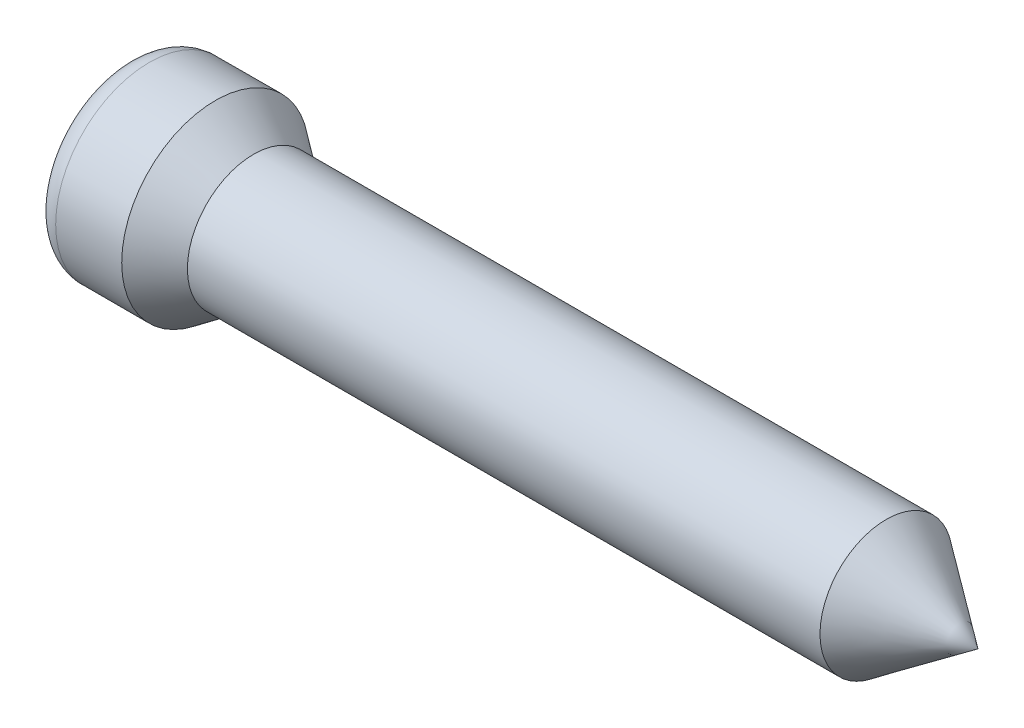
ISO-10303-21;
HEADER;
FILE_DESCRIPTION(('STEP AP214'),'2;1');
FILE_NAME('part.step','',(''),(''),'','','');
FILE_SCHEMA(('AUTOMOTIVE_DESIGN { 1 0 10303 214 1 1 1 1 }'));
ENDSEC;
DATA;
#1=APPLICATION_CONTEXT('core data for automotive mechanical design processes');
#2=APPLICATION_PROTOCOL_DEFINITION('international standard','automotive_design',2000,#1);
#3=PRODUCT_CONTEXT('',#1,'mechanical');
#4=PRODUCT('Part','Part','',(#3));
#5=PRODUCT_RELATED_PRODUCT_CATEGORY('part','',(#4));
#6=PRODUCT_DEFINITION_FORMATION('','',#4);
#7=PRODUCT_DEFINITION_CONTEXT('part definition',#1,'design');
#8=PRODUCT_DEFINITION('design','',#6,#7);
#9=PRODUCT_DEFINITION_SHAPE('','',#8);
#10=(LENGTH_UNIT() NAMED_UNIT(*) SI_UNIT(.MILLI.,.METRE.));
#11=(NAMED_UNIT(*) PLANE_ANGLE_UNIT() SI_UNIT($,.RADIAN.));
#12=(NAMED_UNIT(*) SI_UNIT($,.STERADIAN.) SOLID_ANGLE_UNIT());
#13=UNCERTAINTY_MEASURE_WITH_UNIT(LENGTH_MEASURE(1.E-05),#10,'distance_accuracy_value','');
#14=(GEOMETRIC_REPRESENTATION_CONTEXT(3) GLOBAL_UNCERTAINTY_ASSIGNED_CONTEXT((#13)) GLOBAL_UNIT_ASSIGNED_CONTEXT((#10,
#11,#12)) REPRESENTATION_CONTEXT('',''));
#15=CARTESIAN_POINT('',(0.,0.,0.));
#16=DIRECTION('',(0.,0.,1.));
#17=DIRECTION('',(1.,0.,0.));
#18=AXIS2_PLACEMENT_3D('',#15,#16,#17);
#19=CARTESIAN_POINT('',(-4.2164,0.,0.));
#20=DIRECTION('',(1.,0.,0.));
#21=DIRECTION('',(0.,0.,-1.));
#22=AXIS2_PLACEMENT_3D('',#19,#20,#21);
#23=PLANE('',#22);
#24=CARTESIAN_POINT('',(-4.2164,0.,0.));
#25=DIRECTION('',(1.,0.,0.));
#26=DIRECTION('',(0.,0.,-1.));
#27=AXIS2_PLACEMENT_3D('',#24,#25,#26);
#28=CIRCLE('',#27,2.286);
#29=CARTESIAN_POINT('',(-4.2164,0.,-2.286));
#30=VERTEX_POINT('',#29);
#31=EDGE_CURVE('E39',#30,#30,#28,.F.);
#32=ORIENTED_EDGE('',*,*,#31,.T.);
#33=EDGE_LOOP('',(#32));
#34=FACE_BOUND('',#33,.T.);
#35=ADVANCED_FACE('F32',(#34),#23,.F.);
#36=CARTESIAN_POINT('',(23.495,0.,0.));
#37=DIRECTION('',(-1.,0.,0.));
#38=DIRECTION('',(0.,0.,1.));
#39=AXIS2_PLACEMENT_3D('',#36,#37,#38);
#40=CONICAL_SURFACE('',#39,0.,0.624617277167373);
#41=CARTESIAN_POINT('',(20.5087613828282,0.,0.));
#42=DIRECTION('',(-1.,0.,0.));
#43=DIRECTION('',(0.,0.,1.));
#44=AXIS2_PLACEMENT_3D('',#41,#42,#43);
#45=CIRCLE('',#44,2.1527873514977);
#46=CARTESIAN_POINT('',(20.5087613828282,0.,2.1527873514977));
#47=VERTEX_POINT('',#46);
#48=EDGE_CURVE('E75',#47,#47,#45,.T.);
#49=ORIENTED_EDGE('',*,*,#48,.F.);
#50=EDGE_LOOP('',(#49));
#51=FACE_BOUND('',#50,.T.);
#52=CARTESIAN_POINT('',(23.495,0.,0.));
#53=VERTEX_POINT('',#52);
#54=VERTEX_LOOP('',#53);
#55=FACE_BOUND('',#54,.T.);
#56=ADVANCED_FACE('F42',(#51,#55),#40,.T.);
#57=CARTESIAN_POINT('',(-4.2164,0.,0.));
#58=DIRECTION('',(-1.,0.,0.));
#59=DIRECTION('',(0.,0.,1.));
#60=AXIS2_PLACEMENT_3D('',#57,#58,#59);
#61=CYLINDRICAL_SURFACE('',#60,2.1527873514977);
#62=CARTESIAN_POINT('',(-0.0652386171717673,0.,0.));
#63=DIRECTION('',(-1.,0.,0.));
#64=DIRECTION('',(0.,0.,1.));
#65=AXIS2_PLACEMENT_3D('',#62,#63,#64);
#66=CIRCLE('',#65,2.1527873514977);
#67=CARTESIAN_POINT('',(-0.0652386171717673,0.,2.1527873514977));
#68=VERTEX_POINT('',#67);
#69=EDGE_CURVE('E72',#68,#68,#66,.T.);
#70=ORIENTED_EDGE('',*,*,#69,.F.);
#71=EDGE_LOOP('',(#70));
#72=FACE_BOUND('',#71,.T.);
#73=ORIENTED_EDGE('',*,*,#48,.T.);
#74=EDGE_LOOP('',(#73));
#75=FACE_BOUND('',#74,.T.);
#76=ADVANCED_FACE('F44',(#72,#75),#61,.T.);
#77=CARTESIAN_POINT('',(-0.0652386171717673,0.,0.));
#78=DIRECTION('',(-1.,0.,0.));
#79=DIRECTION('',(0.,0.,1.));
#80=AXIS2_PLACEMENT_3D('',#77,#78,#79);
#81=CONICAL_SURFACE('',#80,2.1527873514977,0.624617277167371);
#82=CARTESIAN_POINT('',(-1.30703269389669,0.,0.));
#83=DIRECTION('',(-1.,0.,0.));
#84=DIRECTION('',(0.,0.,1.));
#85=AXIS2_PLACEMENT_3D('',#82,#83,#84);
#86=CIRCLE('',#85,3.048);
#87=CARTESIAN_POINT('',(-1.30703269389669,0.,3.048));
#88=VERTEX_POINT('',#87);
#89=EDGE_CURVE('E71',#88,#88,#86,.T.);
#90=ORIENTED_EDGE('',*,*,#89,.F.);
#91=EDGE_LOOP('',(#90));
#92=FACE_BOUND('',#91,.T.);
#93=ORIENTED_EDGE('',*,*,#69,.T.);
#94=EDGE_LOOP('',(#93));
#95=FACE_BOUND('',#94,.T.);
#96=ADVANCED_FACE('F51',(#92,#95),#81,.T.);
#97=CARTESIAN_POINT('',(-4.2164,0.,0.));
#98=DIRECTION('',(-1.,0.,0.));
#99=DIRECTION('',(0.,0.,1.));
#100=AXIS2_PLACEMENT_3D('',#97,#98,#99);
#101=CYLINDRICAL_SURFACE('',#100,3.048);
#102=CARTESIAN_POINT('',(-3.4544,0.,0.));
#103=DIRECTION('',(1.,0.,0.));
#104=DIRECTION('',(0.,0.,-1.));
#105=AXIS2_PLACEMENT_3D('',#102,#103,#104);
#106=CIRCLE('',#105,3.048);
#107=CARTESIAN_POINT('',(-3.4544,0.,-3.048));
#108=VERTEX_POINT('',#107);
#109=EDGE_CURVE('E11',#108,#108,#106,.T.);
#110=ORIENTED_EDGE('',*,*,#109,.T.);
#111=EDGE_LOOP('',(#110));
#112=FACE_BOUND('',#111,.T.);
#113=ORIENTED_EDGE('',*,*,#89,.T.);
#114=EDGE_LOOP('',(#113));
#115=FACE_BOUND('',#114,.T.);
#116=ADVANCED_FACE('F59',(#112,#115),#101,.T.);
#117=CARTESIAN_POINT('',(-3.4544,0.,0.));
#118=DIRECTION('',(1.,0.,0.));
#119=DIRECTION('',(0.,0.,-1.));
#120=AXIS2_PLACEMENT_3D('',#117,#118,#119);
#121=TOROIDAL_SURFACE('',#120,2.286,0.762);
#122=ORIENTED_EDGE('',*,*,#109,.F.);
#123=EDGE_LOOP('',(#122));
#124=FACE_BOUND('',#123,.T.);
#125=ORIENTED_EDGE('',*,*,#31,.F.);
#126=EDGE_LOOP('',(#125));
#127=FACE_BOUND('',#126,.T.);
#128=ADVANCED_FACE('F34',(#124,#127),#121,.T.);
#129=CLOSED_SHELL('',(#35,#56,#76,#96,#116,#128));
#130=MANIFOLD_SOLID_BREP('B2',#129);
#131=ADVANCED_BREP_SHAPE_REPRESENTATION('',(#18,#130),#14);
#132=SHAPE_DEFINITION_REPRESENTATION(#9,#131);
ENDSEC;
END-ISO-10303-21;
